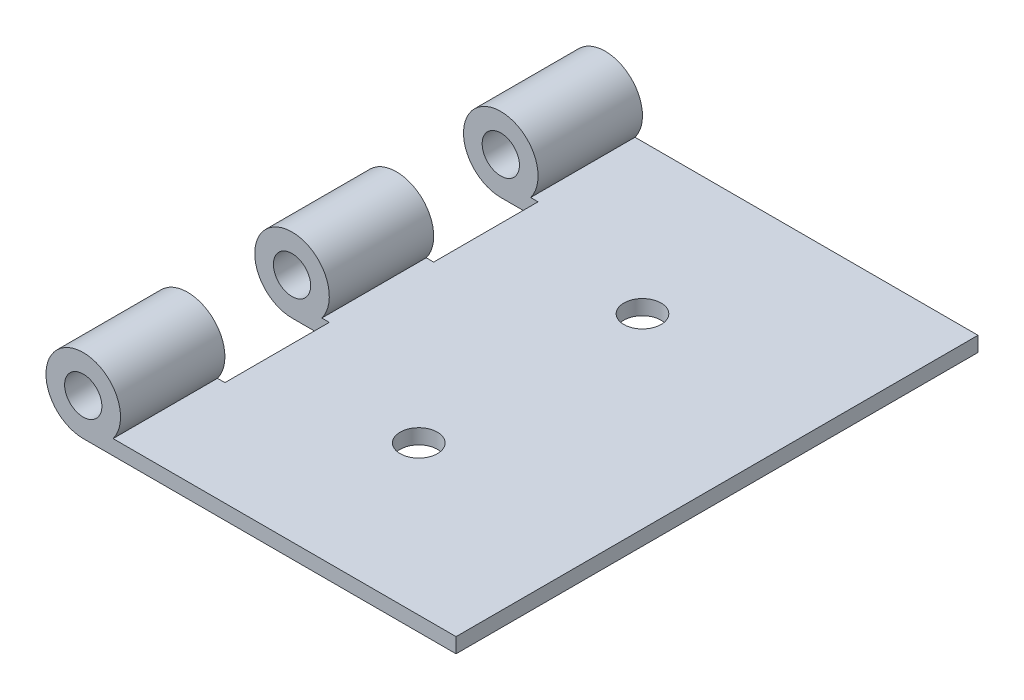
ISO-10303-21;
HEADER;
FILE_DESCRIPTION(('STEP AP214'),'2;1');
FILE_NAME('part.step','',(''),(''),'','','');
FILE_SCHEMA(('AUTOMOTIVE_DESIGN { 1 0 10303 214 1 1 1 1 }'));
ENDSEC;
DATA;
#1=APPLICATION_CONTEXT('core data for automotive mechanical design processes');
#2=APPLICATION_PROTOCOL_DEFINITION('international standard','automotive_design',2000,#1);
#3=PRODUCT_CONTEXT('',#1,'mechanical');
#4=PRODUCT('Part','Part','',(#3));
#5=PRODUCT_RELATED_PRODUCT_CATEGORY('part','',(#4));
#6=PRODUCT_DEFINITION_FORMATION('','',#4);
#7=PRODUCT_DEFINITION_CONTEXT('part definition',#1,'design');
#8=PRODUCT_DEFINITION('design','',#6,#7);
#9=PRODUCT_DEFINITION_SHAPE('','',#8);
#10=(LENGTH_UNIT() NAMED_UNIT(*) SI_UNIT(.MILLI.,.METRE.));
#11=(NAMED_UNIT(*) PLANE_ANGLE_UNIT() SI_UNIT($,.RADIAN.));
#12=(NAMED_UNIT(*) SI_UNIT($,.STERADIAN.) SOLID_ANGLE_UNIT());
#13=UNCERTAINTY_MEASURE_WITH_UNIT(LENGTH_MEASURE(1.E-05),#10,'distance_accuracy_value','');
#14=(GEOMETRIC_REPRESENTATION_CONTEXT(3) GLOBAL_UNCERTAINTY_ASSIGNED_CONTEXT((#13)) GLOBAL_UNIT_ASSIGNED_CONTEXT((#10,
#11,#12)) REPRESENTATION_CONTEXT('',''));
#15=CARTESIAN_POINT('',(0.,0.,0.));
#16=DIRECTION('',(0.,0.,1.));
#17=DIRECTION('',(1.,0.,0.));
#18=AXIS2_PLACEMENT_3D('',#15,#16,#17);
#19=CARTESIAN_POINT('',(-25.,5.,-49.142135623731));
#20=DIRECTION('',(0.,0.,1.));
#21=DIRECTION('',(1.,0.,0.));
#22=AXIS2_PLACEMENT_3D('',#19,#20,#21);
#23=CYLINDRICAL_SURFACE('',#22,5.);
#24=CARTESIAN_POINT('',(-25.,5.,21.));
#25=DIRECTION('',(0.,0.,1.));
#26=DIRECTION('',(1.,0.,0.));
#27=AXIS2_PLACEMENT_3D('',#24,#25,#26);
#28=CIRCLE('',#27,5.);
#29=CARTESIAN_POINT('',(-25.,0.,21.));
#30=VERTEX_POINT('',#29);
#31=CARTESIAN_POINT('',(-21.,2.,21.));
#32=VERTEX_POINT('',#31);
#33=EDGE_CURVE('E201',#30,#32,#28,.F.);
#34=ORIENTED_EDGE('',*,*,#33,.F.);
#35=DIRECTION('',(0.,0.,1.));
#36=VECTOR('',#35,1.);
#37=CARTESIAN_POINT('',(-25.,0.,-35.));
#38=LINE('',#37,#36);
#39=CARTESIAN_POINT('',(-25.,0.,35.));
#40=VERTEX_POINT('',#39);
#41=EDGE_CURVE('E158',#30,#40,#38,.T.);
#42=ORIENTED_EDGE('',*,*,#41,.T.);
#43=CARTESIAN_POINT('',(-25.,5.,35.));
#44=DIRECTION('',(0.,0.,1.));
#45=DIRECTION('',(1.,0.,0.));
#46=AXIS2_PLACEMENT_3D('',#43,#44,#45);
#47=CIRCLE('',#46,5.);
#48=CARTESIAN_POINT('',(-21.,2.,35.));
#49=VERTEX_POINT('',#48);
#50=EDGE_CURVE('E243',#49,#40,#47,.T.);
#51=ORIENTED_EDGE('',*,*,#50,.F.);
#52=DIRECTION('',(0.,0.,1.));
#53=VECTOR('',#52,1.);
#54=CARTESIAN_POINT('',(-21.,2.,-49.142135623731));
#55=LINE('',#54,#53);
#56=EDGE_CURVE('E56',#49,#32,#55,.F.);
#57=ORIENTED_EDGE('',*,*,#56,.T.);
#58=EDGE_LOOP('',(#34,#42,#51,#57));
#59=FACE_BOUND('',#58,.T.);
#60=ADVANCED_FACE('F38',(#59),#23,.T.);
#61=CARTESIAN_POINT('',(-25.,5.,7.00000000000001));
#62=DIRECTION('',(0.,0.,-1.));
#63=DIRECTION('',(-1.,0.,0.));
#64=AXIS2_PLACEMENT_3D('',#61,#62,#63);
#65=CIRCLE('',#64,5.);
#66=CARTESIAN_POINT('',(-21.,2.,7.00000000000001));
#67=VERTEX_POINT('',#66);
#68=CARTESIAN_POINT('',(-25.,0.,7.));
#69=VERTEX_POINT('',#68);
#70=EDGE_CURVE('E206',#67,#69,#65,.F.);
#71=ORIENTED_EDGE('',*,*,#70,.F.);
#72=CARTESIAN_POINT('',(-21.,2.,-6.99999999999999));
#73=VERTEX_POINT('',#72);
#74=EDGE_CURVE('E253',#67,#73,#55,.F.);
#75=ORIENTED_EDGE('',*,*,#74,.T.);
#76=CARTESIAN_POINT('',(-25.,5.,-6.99999999999999));
#77=DIRECTION('',(0.,0.,1.));
#78=DIRECTION('',(1.,0.,0.));
#79=AXIS2_PLACEMENT_3D('',#76,#77,#78);
#80=CIRCLE('',#79,5.);
#81=CARTESIAN_POINT('',(-25.,0.,-6.99999999999999));
#82=VERTEX_POINT('',#81);
#83=EDGE_CURVE('E187',#82,#73,#80,.F.);
#84=ORIENTED_EDGE('',*,*,#83,.F.);
#85=EDGE_CURVE('E275',#82,#69,#38,.T.);
#86=ORIENTED_EDGE('',*,*,#85,.T.);
#87=EDGE_LOOP('',(#71,#75,#84,#86));
#88=FACE_BOUND('',#87,.T.);
#89=ADVANCED_FACE('F306',(#88),#23,.T.);
#90=CARTESIAN_POINT('',(-25.,5.,-49.142135623731));
#91=DIRECTION('',(0.,0.,1.));
#92=DIRECTION('',(1.,0.,0.));
#93=AXIS2_PLACEMENT_3D('',#90,#91,#92);
#94=CYLINDRICAL_SURFACE('',#93,2.5);
#95=CARTESIAN_POINT('',(-25.,5.,-21.));
#96=DIRECTION('',(0.,0.,-1.));
#97=DIRECTION('',(-1.,0.,0.));
#98=AXIS2_PLACEMENT_3D('',#95,#96,#97);
#99=CIRCLE('',#98,2.5);
#100=CARTESIAN_POINT('',(-27.5,5.,-21.));
#101=VERTEX_POINT('',#100);
#102=EDGE_CURVE('E193',#101,#101,#99,.F.);
#103=ORIENTED_EDGE('',*,*,#102,.T.);
#104=EDGE_LOOP('',(#103));
#105=FACE_BOUND('',#104,.T.);
#106=CARTESIAN_POINT('',(-25.,5.,-35.));
#107=DIRECTION('',(0.,0.,1.));
#108=DIRECTION('',(1.,0.,0.));
#109=AXIS2_PLACEMENT_3D('',#106,#107,#108);
#110=CIRCLE('',#109,2.5);
#111=CARTESIAN_POINT('',(-22.5,5.,-35.));
#112=VERTEX_POINT('',#111);
#113=EDGE_CURVE('E239',#112,#112,#110,.F.);
#114=ORIENTED_EDGE('',*,*,#113,.T.);
#115=EDGE_LOOP('',(#114));
#116=FACE_BOUND('',#115,.T.);
#117=ADVANCED_FACE('F313',(#105,#116),#94,.F.);
#118=CARTESIAN_POINT('',(25.,2.,-35.));
#119=DIRECTION('',(-1.,0.,0.));
#120=DIRECTION('',(0.,0.,1.));
#121=AXIS2_PLACEMENT_3D('',#118,#119,#120);
#122=PLANE('',#121);
#123=DIRECTION('',(0.,0.,-1.));
#124=VECTOR('',#123,1.);
#125=CARTESIAN_POINT('',(25.,0.,-35.));
#126=LINE('',#125,#124);
#127=CARTESIAN_POINT('',(25.,0.,35.));
#128=VERTEX_POINT('',#127);
#129=CARTESIAN_POINT('',(25.,0.,-35.));
#130=VERTEX_POINT('',#129);
#131=EDGE_CURVE('E252',#128,#130,#126,.T.);
#132=ORIENTED_EDGE('',*,*,#131,.T.);
#133=DIRECTION('',(0.,-1.,0.));
#134=VECTOR('',#133,1.);
#135=CARTESIAN_POINT('',(25.,2.,-35.));
#136=LINE('',#135,#134);
#137=CARTESIAN_POINT('',(25.,2.,-35.));
#138=VERTEX_POINT('',#137);
#139=EDGE_CURVE('E11',#138,#130,#136,.T.);
#140=ORIENTED_EDGE('',*,*,#139,.F.);
#141=DIRECTION('',(0.,0.,-1.));
#142=VECTOR('',#141,1.);
#143=CARTESIAN_POINT('',(25.,2.,-35.));
#144=LINE('',#143,#142);
#145=CARTESIAN_POINT('',(25.,2.,35.));
#146=VERTEX_POINT('',#145);
#147=EDGE_CURVE('E254',#146,#138,#144,.T.);
#148=ORIENTED_EDGE('',*,*,#147,.F.);
#149=DIRECTION('',(0.,-1.,0.));
#150=VECTOR('',#149,1.);
#151=CARTESIAN_POINT('',(25.,2.,35.));
#152=LINE('',#151,#150);
#153=EDGE_CURVE('E48',#146,#128,#152,.T.);
#154=ORIENTED_EDGE('',*,*,#153,.T.);
#155=EDGE_LOOP('',(#132,#140,#148,#154));
#156=FACE_BOUND('',#155,.T.);
#157=ADVANCED_FACE('F40',(#156),#122,.F.);
#158=CARTESIAN_POINT('',(-25.,2.,-35.));
#159=DIRECTION('',(0.,0.,1.));
#160=DIRECTION('',(1.,0.,0.));
#161=AXIS2_PLACEMENT_3D('',#158,#159,#160);
#162=PLANE('',#161);
#163=DIRECTION('',(-1.,0.,0.));
#164=VECTOR('',#163,1.);
#165=CARTESIAN_POINT('',(-25.,0.,-35.));
#166=LINE('',#165,#164);
#167=CARTESIAN_POINT('',(-25.,0.,-35.));
#168=VERTEX_POINT('',#167);
#169=EDGE_CURVE('E268',#130,#168,#166,.T.);
#170=ORIENTED_EDGE('',*,*,#169,.T.);
#171=CARTESIAN_POINT('',(-25.,5.,-35.));
#172=DIRECTION('',(0.,0.,1.));
#173=DIRECTION('',(1.,0.,0.));
#174=AXIS2_PLACEMENT_3D('',#171,#172,#173);
#175=CIRCLE('',#174,5.);
#176=CARTESIAN_POINT('',(-21.,2.,-35.));
#177=VERTEX_POINT('',#176);
#178=EDGE_CURVE('E235',#168,#177,#175,.F.);
#179=ORIENTED_EDGE('',*,*,#178,.T.);
#180=DIRECTION('',(-1.,0.,0.));
#181=VECTOR('',#180,1.);
#182=CARTESIAN_POINT('',(-25.,2.,-35.));
#183=LINE('',#182,#181);
#184=EDGE_CURVE('E258',#138,#177,#183,.T.);
#185=ORIENTED_EDGE('',*,*,#184,.F.);
#186=ORIENTED_EDGE('',*,*,#139,.T.);
#187=EDGE_LOOP('',(#170,#179,#185,#186));
#188=FACE_BOUND('',#187,.T.);
#189=ORIENTED_EDGE('',*,*,#113,.F.);
#190=EDGE_LOOP('',(#189));
#191=FACE_BOUND('',#190,.T.);
#192=ADVANCED_FACE('F359',(#188,#191),#162,.F.);
#193=CARTESIAN_POINT('',(-25.,2.,35.));
#194=DIRECTION('',(0.,0.,-1.));
#195=DIRECTION('',(-1.,0.,0.));
#196=AXIS2_PLACEMENT_3D('',#193,#194,#195);
#197=PLANE('',#196);
#198=ORIENTED_EDGE('',*,*,#50,.T.);
#199=DIRECTION('',(1.,0.,0.));
#200=VECTOR('',#199,1.);
#201=CARTESIAN_POINT('',(-25.,0.,35.));
#202=LINE('',#201,#200);
#203=EDGE_CURVE('E259',#40,#128,#202,.T.);
#204=ORIENTED_EDGE('',*,*,#203,.T.);
#205=ORIENTED_EDGE('',*,*,#153,.F.);
#206=DIRECTION('',(1.,0.,0.));
#207=VECTOR('',#206,1.);
#208=CARTESIAN_POINT('',(-25.,2.,35.));
#209=LINE('',#208,#207);
#210=EDGE_CURVE('E262',#49,#146,#209,.T.);
#211=ORIENTED_EDGE('',*,*,#210,.F.);
#212=EDGE_LOOP('',(#198,#204,#205,#211));
#213=FACE_BOUND('',#212,.T.);
#214=CARTESIAN_POINT('',(-25.,5.,35.));
#215=DIRECTION('',(0.,0.,1.));
#216=DIRECTION('',(1.,0.,0.));
#217=AXIS2_PLACEMENT_3D('',#214,#215,#216);
#218=CIRCLE('',#217,2.5);
#219=CARTESIAN_POINT('',(-22.5,5.,35.));
#220=VERTEX_POINT('',#219);
#221=EDGE_CURVE('E223',#220,#220,#218,.T.);
#222=ORIENTED_EDGE('',*,*,#221,.F.);
#223=EDGE_LOOP('',(#222));
#224=FACE_BOUND('',#223,.T.);
#225=ADVANCED_FACE('F353',(#213,#224),#197,.F.);
#226=CARTESIAN_POINT('',(0.,2.,0.));
#227=DIRECTION('',(0.,1.,0.));
#228=DIRECTION('',(0.,0.,1.));
#229=AXIS2_PLACEMENT_3D('',#226,#227,#228);
#230=PLANE('',#229);
#231=DIRECTION('',(-1.,0.,0.));
#232=VECTOR('',#231,1.);
#233=CARTESIAN_POINT('',(0.,2.,7.));
#234=LINE('',#233,#232);
#235=CARTESIAN_POINT('',(-20.,2.,7.));
#236=VERTEX_POINT('',#235);
#237=EDGE_CURVE('E209',#236,#67,#234,.T.);
#238=ORIENTED_EDGE('',*,*,#237,.F.);
#239=DIRECTION('',(0.,0.,-1.));
#240=VECTOR('',#239,1.);
#241=CARTESIAN_POINT('',(-20.,2.,0.));
#242=LINE('',#241,#240);
#243=CARTESIAN_POINT('',(-20.,2.,21.));
#244=VERTEX_POINT('',#243);
#245=EDGE_CURVE('E215',#244,#236,#242,.T.);
#246=ORIENTED_EDGE('',*,*,#245,.F.);
#247=DIRECTION('',(1.,0.,0.));
#248=VECTOR('',#247,1.);
#249=CARTESIAN_POINT('',(0.,2.,21.));
#250=LINE('',#249,#248);
#251=EDGE_CURVE('E140',#32,#244,#250,.T.);
#252=ORIENTED_EDGE('',*,*,#251,.F.);
#253=ORIENTED_EDGE('',*,*,#56,.F.);
#254=ORIENTED_EDGE('',*,*,#210,.T.);
#255=ORIENTED_EDGE('',*,*,#147,.T.);
#256=ORIENTED_EDGE('',*,*,#184,.T.);
#257=CARTESIAN_POINT('',(-21.,2.,-21.));
#258=VERTEX_POINT('',#257);
#259=EDGE_CURVE('E64',#258,#177,#55,.F.);
#260=ORIENTED_EDGE('',*,*,#259,.F.);
#261=DIRECTION('',(-1.,0.,0.));
#262=VECTOR('',#261,1.);
#263=CARTESIAN_POINT('',(0.,2.,-21.));
#264=LINE('',#263,#262);
#265=CARTESIAN_POINT('',(-20.,2.,-21.));
#266=VERTEX_POINT('',#265);
#267=EDGE_CURVE('E197',#266,#258,#264,.T.);
#268=ORIENTED_EDGE('',*,*,#267,.F.);
#269=DIRECTION('',(0.,0.,-1.));
#270=VECTOR('',#269,1.);
#271=CARTESIAN_POINT('',(-20.,2.,0.));
#272=LINE('',#271,#270);
#273=CARTESIAN_POINT('',(-20.,2.,-6.99999999999999));
#274=VERTEX_POINT('',#273);
#275=EDGE_CURVE('E212',#274,#266,#272,.T.);
#276=ORIENTED_EDGE('',*,*,#275,.F.);
#277=DIRECTION('',(1.,0.,0.));
#278=VECTOR('',#277,1.);
#279=CARTESIAN_POINT('',(0.,2.,-6.99999999999999));
#280=LINE('',#279,#278);
#281=EDGE_CURVE('E190',#73,#274,#280,.T.);
#282=ORIENTED_EDGE('',*,*,#281,.F.);
#283=ORIENTED_EDGE('',*,*,#74,.F.);
#284=EDGE_LOOP('',(#238,#246,#252,#253,#254,#255,#256,#260,#268,#276,#282,#283));
#285=FACE_BOUND('',#284,.T.);
#286=CARTESIAN_POINT('',(0.,2.,-15.));
#287=DIRECTION('',(0.,1.,0.));
#288=DIRECTION('',(0.,0.,1.));
#289=AXIS2_PLACEMENT_3D('',#286,#287,#288);
#290=CIRCLE('',#289,2.5);
#291=CARTESIAN_POINT('',(0.,2.,-12.5));
#292=VERTEX_POINT('',#291);
#293=EDGE_CURVE('E224',#292,#292,#290,.T.);
#294=ORIENTED_EDGE('',*,*,#293,.F.);
#295=EDGE_LOOP('',(#294));
#296=FACE_BOUND('',#295,.T.);
#297=CARTESIAN_POINT('',(0.,2.,15.));
#298=DIRECTION('',(0.,1.,0.));
#299=DIRECTION('',(0.,0.,1.));
#300=AXIS2_PLACEMENT_3D('',#297,#298,#299);
#301=CIRCLE('',#300,2.5);
#302=CARTESIAN_POINT('',(0.,2.,17.5));
#303=VERTEX_POINT('',#302);
#304=EDGE_CURVE('E218',#303,#303,#301,.T.);
#305=ORIENTED_EDGE('',*,*,#304,.F.);
#306=EDGE_LOOP('',(#305));
#307=FACE_BOUND('',#306,.T.);
#308=ADVANCED_FACE('F323',(#285,#296,#307),#230,.T.);
#309=CARTESIAN_POINT('',(0.,0.,0.));
#310=DIRECTION('',(0.,1.,0.));
#311=DIRECTION('',(0.,0.,1.));
#312=AXIS2_PLACEMENT_3D('',#309,#310,#311);
#313=PLANE('',#312);
#314=CARTESIAN_POINT('',(0.,0.,-15.));
#315=DIRECTION('',(0.,1.,0.));
#316=DIRECTION('',(0.,0.,1.));
#317=AXIS2_PLACEMENT_3D('',#314,#315,#316);
#318=CIRCLE('',#317,2.5);
#319=CARTESIAN_POINT('',(0.,0.,-12.5));
#320=VERTEX_POINT('',#319);
#321=EDGE_CURVE('E219',#320,#320,#318,.T.);
#322=ORIENTED_EDGE('',*,*,#321,.T.);
#323=EDGE_LOOP('',(#322));
#324=FACE_BOUND('',#323,.T.);
#325=CARTESIAN_POINT('',(0.,0.,15.));
#326=DIRECTION('',(0.,1.,0.));
#327=DIRECTION('',(0.,0.,1.));
#328=AXIS2_PLACEMENT_3D('',#325,#326,#327);
#329=CIRCLE('',#328,2.5);
#330=CARTESIAN_POINT('',(0.,0.,17.5));
#331=VERTEX_POINT('',#330);
#332=EDGE_CURVE('E228',#331,#331,#329,.T.);
#333=ORIENTED_EDGE('',*,*,#332,.T.);
#334=EDGE_LOOP('',(#333));
#335=FACE_BOUND('',#334,.T.);
#336=DIRECTION('',(0.,0.,-1.));
#337=VECTOR('',#336,1.);
#338=CARTESIAN_POINT('',(-20.,0.,7.));
#339=LINE('',#338,#337);
#340=CARTESIAN_POINT('',(-20.,0.,21.));
#341=VERTEX_POINT('',#340);
#342=CARTESIAN_POINT('',(-20.,0.,7.));
#343=VERTEX_POINT('',#342);
#344=EDGE_CURVE('E148',#341,#343,#339,.T.);
#345=ORIENTED_EDGE('',*,*,#344,.T.);
#346=DIRECTION('',(-1.,0.,0.));
#347=VECTOR('',#346,1.);
#348=CARTESIAN_POINT('',(-30.,0.,7.));
#349=LINE('',#348,#347);
#350=EDGE_CURVE('E145',#343,#69,#349,.T.);
#351=ORIENTED_EDGE('',*,*,#350,.T.);
#352=ORIENTED_EDGE('',*,*,#85,.F.);
#353=DIRECTION('',(1.,0.,0.));
#354=VECTOR('',#353,1.);
#355=CARTESIAN_POINT('',(-30.,0.,-7.));
#356=LINE('',#355,#354);
#357=CARTESIAN_POINT('',(-20.,0.,-6.99999999999999));
#358=VERTEX_POINT('',#357);
#359=EDGE_CURVE('E172',#82,#358,#356,.T.);
#360=ORIENTED_EDGE('',*,*,#359,.T.);
#361=DIRECTION('',(0.,0.,-1.));
#362=VECTOR('',#361,1.);
#363=CARTESIAN_POINT('',(-20.,0.,-21.));
#364=LINE('',#363,#362);
#365=CARTESIAN_POINT('',(-20.,0.,-21.));
#366=VERTEX_POINT('',#365);
#367=EDGE_CURVE('E176',#358,#366,#364,.T.);
#368=ORIENTED_EDGE('',*,*,#367,.T.);
#369=DIRECTION('',(-1.,0.,0.));
#370=VECTOR('',#369,1.);
#371=CARTESIAN_POINT('',(-30.,0.,-21.));
#372=LINE('',#371,#370);
#373=CARTESIAN_POINT('',(-25.,0.,-21.));
#374=VERTEX_POINT('',#373);
#375=EDGE_CURVE('E180',#366,#374,#372,.T.);
#376=ORIENTED_EDGE('',*,*,#375,.T.);
#377=EDGE_CURVE('E271',#168,#374,#38,.T.);
#378=ORIENTED_EDGE('',*,*,#377,.F.);
#379=ORIENTED_EDGE('',*,*,#169,.F.);
#380=ORIENTED_EDGE('',*,*,#131,.F.);
#381=ORIENTED_EDGE('',*,*,#203,.F.);
#382=ORIENTED_EDGE('',*,*,#41,.F.);
#383=DIRECTION('',(1.,0.,0.));
#384=VECTOR('',#383,1.);
#385=CARTESIAN_POINT('',(-30.,0.,21.));
#386=LINE('',#385,#384);
#387=EDGE_CURVE('E138',#30,#341,#386,.T.);
#388=ORIENTED_EDGE('',*,*,#387,.T.);
#389=EDGE_LOOP('',(#345,#351,#352,#360,#368,#376,#378,#379,#380,#381,#382,#388));
#390=FACE_BOUND('',#389,.T.);
#391=ADVANCED_FACE('F156',(#324,#335,#390),#313,.F.);
#392=CARTESIAN_POINT('',(-25.,5.,-21.));
#393=DIRECTION('',(0.,0.,-1.));
#394=DIRECTION('',(-1.,0.,0.));
#395=AXIS2_PLACEMENT_3D('',#392,#393,#394);
#396=CIRCLE('',#395,5.);
#397=EDGE_CURVE('E194',#258,#374,#396,.F.);
#398=ORIENTED_EDGE('',*,*,#397,.F.);
#399=ORIENTED_EDGE('',*,*,#259,.T.);
#400=ORIENTED_EDGE('',*,*,#178,.F.);
#401=ORIENTED_EDGE('',*,*,#377,.T.);
#402=EDGE_LOOP('',(#398,#399,#400,#401));
#403=FACE_BOUND('',#402,.T.);
#404=ADVANCED_FACE('F309',(#403),#23,.T.);
#405=CARTESIAN_POINT('',(-25.,5.,21.));
#406=DIRECTION('',(0.,0.,1.));
#407=DIRECTION('',(1.,0.,0.));
#408=AXIS2_PLACEMENT_3D('',#405,#406,#407);
#409=CIRCLE('',#408,2.5);
#410=CARTESIAN_POINT('',(-22.5,5.,21.));
#411=VERTEX_POINT('',#410);
#412=EDGE_CURVE('E200',#411,#411,#409,.F.);
#413=ORIENTED_EDGE('',*,*,#412,.T.);
#414=EDGE_LOOP('',(#413));
#415=FACE_BOUND('',#414,.T.);
#416=ORIENTED_EDGE('',*,*,#221,.T.);
#417=EDGE_LOOP('',(#416));
#418=FACE_BOUND('',#417,.T.);
#419=ADVANCED_FACE('F290',(#415,#418),#94,.F.);
#420=CARTESIAN_POINT('',(0.,0.,15.));
#421=DIRECTION('',(0.,1.,0.));
#422=DIRECTION('',(0.,0.,1.));
#423=AXIS2_PLACEMENT_3D('',#420,#421,#422);
#424=CYLINDRICAL_SURFACE('',#423,2.5);
#425=ORIENTED_EDGE('',*,*,#332,.F.);
#426=EDGE_LOOP('',(#425));
#427=FACE_BOUND('',#426,.T.);
#428=ORIENTED_EDGE('',*,*,#304,.T.);
#429=EDGE_LOOP('',(#428));
#430=FACE_BOUND('',#429,.T.);
#431=ADVANCED_FACE('F322',(#427,#430),#424,.F.);
#432=CARTESIAN_POINT('',(0.,0.,-15.));
#433=DIRECTION('',(0.,1.,0.));
#434=DIRECTION('',(0.,0.,1.));
#435=AXIS2_PLACEMENT_3D('',#432,#433,#434);
#436=CYLINDRICAL_SURFACE('',#435,2.5);
#437=ORIENTED_EDGE('',*,*,#321,.F.);
#438=EDGE_LOOP('',(#437));
#439=FACE_BOUND('',#438,.T.);
#440=ORIENTED_EDGE('',*,*,#293,.T.);
#441=EDGE_LOOP('',(#440));
#442=FACE_BOUND('',#441,.T.);
#443=ADVANCED_FACE('F364',(#439,#442),#436,.F.);
#444=CARTESIAN_POINT('',(-30.,0.,-21.));
#445=DIRECTION('',(0.,0.,-1.));
#446=DIRECTION('',(-1.,0.,0.));
#447=AXIS2_PLACEMENT_3D('',#444,#445,#446);
#448=PLANE('',#447);
#449=ORIENTED_EDGE('',*,*,#267,.T.);
#450=ORIENTED_EDGE('',*,*,#397,.T.);
#451=ORIENTED_EDGE('',*,*,#375,.F.);
#452=DIRECTION('',(0.,1.,0.));
#453=VECTOR('',#452,1.);
#454=CARTESIAN_POINT('',(-20.,0.,-21.));
#455=LINE('',#454,#453);
#456=EDGE_CURVE('E160',#366,#266,#455,.T.);
#457=ORIENTED_EDGE('',*,*,#456,.T.);
#458=EDGE_LOOP('',(#449,#450,#451,#457));
#459=FACE_BOUND('',#458,.T.);
#460=ORIENTED_EDGE('',*,*,#102,.F.);
#461=EDGE_LOOP('',(#460));
#462=FACE_BOUND('',#461,.T.);
#463=ADVANCED_FACE('F361',(#459,#462),#448,.F.);
#464=CARTESIAN_POINT('',(-30.,0.,-7.));
#465=DIRECTION('',(0.,0.,1.));
#466=DIRECTION('',(1.,0.,0.));
#467=AXIS2_PLACEMENT_3D('',#464,#465,#466);
#468=PLANE('',#467);
#469=ORIENTED_EDGE('',*,*,#281,.T.);
#470=DIRECTION('',(0.,1.,0.));
#471=VECTOR('',#470,1.);
#472=CARTESIAN_POINT('',(-20.,0.,-6.99999999999999));
#473=LINE('',#472,#471);
#474=EDGE_CURVE('E164',#358,#274,#473,.T.);
#475=ORIENTED_EDGE('',*,*,#474,.F.);
#476=ORIENTED_EDGE('',*,*,#359,.F.);
#477=ORIENTED_EDGE('',*,*,#83,.T.);
#478=EDGE_LOOP('',(#469,#475,#476,#477));
#479=FACE_BOUND('',#478,.T.);
#480=CARTESIAN_POINT('',(-25.,5.,-6.99999999999999));
#481=DIRECTION('',(0.,0.,1.));
#482=DIRECTION('',(1.,0.,0.));
#483=AXIS2_PLACEMENT_3D('',#480,#481,#482);
#484=CIRCLE('',#483,2.5);
#485=CARTESIAN_POINT('',(-22.5,5.,-6.99999999999999));
#486=VERTEX_POINT('',#485);
#487=EDGE_CURVE('E170',#486,#486,#484,.F.);
#488=ORIENTED_EDGE('',*,*,#487,.F.);
#489=EDGE_LOOP('',(#488));
#490=FACE_BOUND('',#489,.T.);
#491=ADVANCED_FACE('F342',(#479,#490),#468,.F.);
#492=CARTESIAN_POINT('',(-20.,0.,-21.));
#493=DIRECTION('',(1.,0.,0.));
#494=DIRECTION('',(0.,0.,-1.));
#495=AXIS2_PLACEMENT_3D('',#492,#493,#494);
#496=PLANE('',#495);
#497=ORIENTED_EDGE('',*,*,#275,.T.);
#498=ORIENTED_EDGE('',*,*,#456,.F.);
#499=ORIENTED_EDGE('',*,*,#367,.F.);
#500=ORIENTED_EDGE('',*,*,#474,.T.);
#501=EDGE_LOOP('',(#497,#498,#499,#500));
#502=FACE_BOUND('',#501,.T.);
#503=ADVANCED_FACE('F301',(#502),#496,.F.);
#504=CARTESIAN_POINT('',(-30.,0.,7.));
#505=DIRECTION('',(0.,0.,-1.));
#506=DIRECTION('',(-1.,0.,0.));
#507=AXIS2_PLACEMENT_3D('',#504,#505,#506);
#508=PLANE('',#507);
#509=ORIENTED_EDGE('',*,*,#237,.T.);
#510=ORIENTED_EDGE('',*,*,#70,.T.);
#511=ORIENTED_EDGE('',*,*,#350,.F.);
#512=DIRECTION('',(0.,1.,0.));
#513=VECTOR('',#512,1.);
#514=CARTESIAN_POINT('',(-20.,0.,7.));
#515=LINE('',#514,#513);
#516=EDGE_CURVE('E144',#343,#236,#515,.T.);
#517=ORIENTED_EDGE('',*,*,#516,.T.);
#518=EDGE_LOOP('',(#509,#510,#511,#517));
#519=FACE_BOUND('',#518,.T.);
#520=CARTESIAN_POINT('',(-25.,5.,7.00000000000001));
#521=DIRECTION('',(0.,0.,-1.));
#522=DIRECTION('',(-1.,0.,0.));
#523=AXIS2_PLACEMENT_3D('',#520,#521,#522);
#524=CIRCLE('',#523,2.5);
#525=CARTESIAN_POINT('',(-27.5,5.,7.00000000000001));
#526=VERTEX_POINT('',#525);
#527=EDGE_CURVE('E42',#526,#526,#524,.F.);
#528=ORIENTED_EDGE('',*,*,#527,.F.);
#529=EDGE_LOOP('',(#528));
#530=FACE_BOUND('',#529,.T.);
#531=ADVANCED_FACE('F293',(#519,#530),#508,.F.);
#532=CARTESIAN_POINT('',(-30.,0.,21.));
#533=DIRECTION('',(0.,0.,1.));
#534=DIRECTION('',(1.,0.,0.));
#535=AXIS2_PLACEMENT_3D('',#532,#533,#534);
#536=PLANE('',#535);
#537=ORIENTED_EDGE('',*,*,#251,.T.);
#538=DIRECTION('',(0.,1.,0.));
#539=VECTOR('',#538,1.);
#540=CARTESIAN_POINT('',(-20.,0.,21.));
#541=LINE('',#540,#539);
#542=EDGE_CURVE('E133',#341,#244,#541,.T.);
#543=ORIENTED_EDGE('',*,*,#542,.F.);
#544=ORIENTED_EDGE('',*,*,#387,.F.);
#545=ORIENTED_EDGE('',*,*,#33,.T.);
#546=EDGE_LOOP('',(#537,#543,#544,#545));
#547=FACE_BOUND('',#546,.T.);
#548=ORIENTED_EDGE('',*,*,#412,.F.);
#549=EDGE_LOOP('',(#548));
#550=FACE_BOUND('',#549,.T.);
#551=ADVANCED_FACE('F135',(#547,#550),#536,.F.);
#552=CARTESIAN_POINT('',(-20.,0.,7.));
#553=DIRECTION('',(1.,0.,0.));
#554=DIRECTION('',(0.,0.,-1.));
#555=AXIS2_PLACEMENT_3D('',#552,#553,#554);
#556=PLANE('',#555);
#557=ORIENTED_EDGE('',*,*,#245,.T.);
#558=ORIENTED_EDGE('',*,*,#516,.F.);
#559=ORIENTED_EDGE('',*,*,#344,.F.);
#560=ORIENTED_EDGE('',*,*,#542,.T.);
#561=EDGE_LOOP('',(#557,#558,#559,#560));
#562=FACE_BOUND('',#561,.T.);
#563=ADVANCED_FACE('F149',(#562),#556,.F.);
#564=ORIENTED_EDGE('',*,*,#527,.T.);
#565=EDGE_LOOP('',(#564));
#566=FACE_BOUND('',#565,.T.);
#567=ORIENTED_EDGE('',*,*,#487,.T.);
#568=EDGE_LOOP('',(#567));
#569=FACE_BOUND('',#568,.T.);
#570=ADVANCED_FACE('F299',(#566,#569),#94,.F.);
#571=CLOSED_SHELL('',(#60,#89,#117,#157,#192,#225,#308,#391,#404,#419,#431,#443,#463,#491,#503,
#531,#551,#563,#570));
#572=MANIFOLD_SOLID_BREP('B2',#571);
#573=ADVANCED_BREP_SHAPE_REPRESENTATION('',(#18,#572),#14);
#574=SHAPE_DEFINITION_REPRESENTATION(#9,#573);
ENDSEC;
END-ISO-10303-21;
